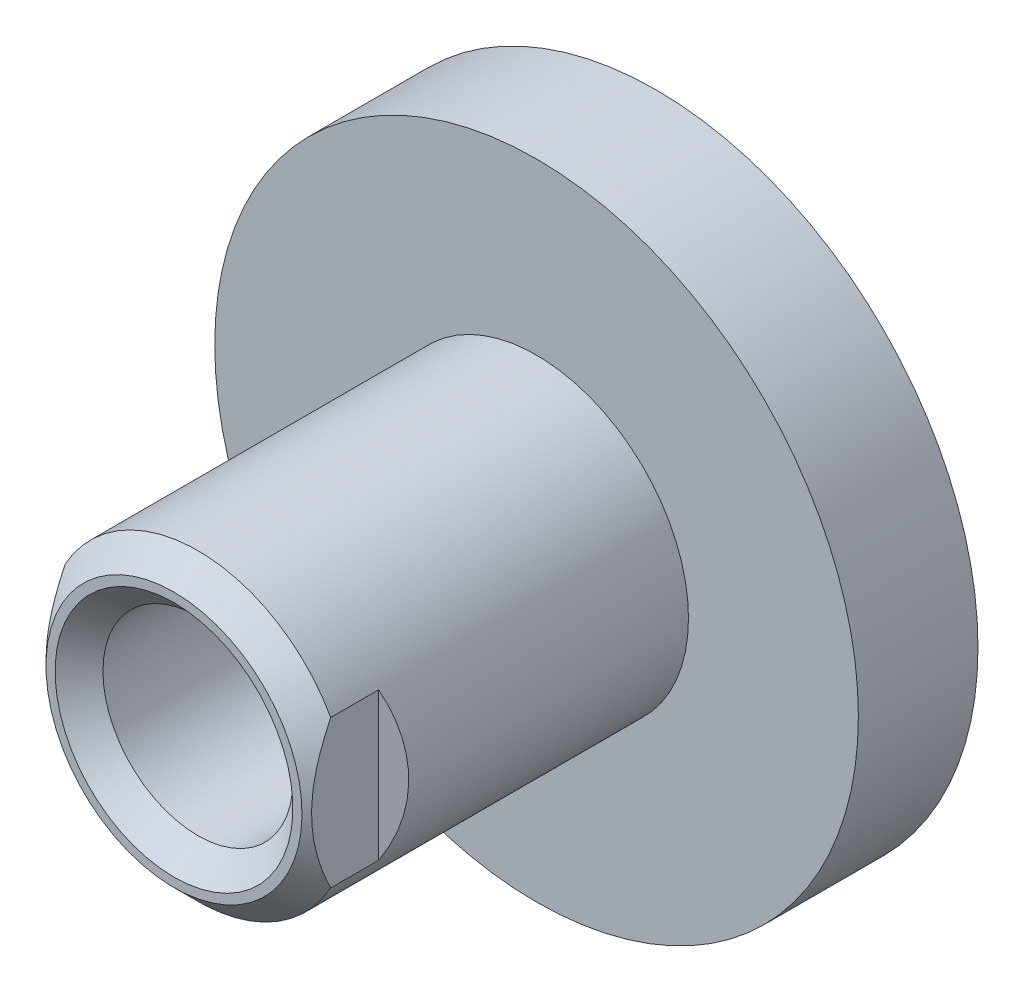
ISO-10303-21;
HEADER;
FILE_DESCRIPTION(('STEP AP214'),'2;1');
FILE_NAME('part.step','',(''),(''),'','','');
FILE_SCHEMA(('AUTOMOTIVE_DESIGN { 1 0 10303 214 1 1 1 1 }'));
ENDSEC;
DATA;
#1=APPLICATION_CONTEXT('core data for automotive mechanical design processes');
#2=APPLICATION_PROTOCOL_DEFINITION('international standard','automotive_design',2000,#1);
#3=PRODUCT_CONTEXT('',#1,'mechanical');
#4=PRODUCT('Part','Part','',(#3));
#5=PRODUCT_RELATED_PRODUCT_CATEGORY('part','',(#4));
#6=PRODUCT_DEFINITION_FORMATION('','',#4);
#7=PRODUCT_DEFINITION_CONTEXT('part definition',#1,'design');
#8=PRODUCT_DEFINITION('design','',#6,#7);
#9=PRODUCT_DEFINITION_SHAPE('','',#8);
#10=(LENGTH_UNIT() NAMED_UNIT(*) SI_UNIT(.MILLI.,.METRE.));
#11=(NAMED_UNIT(*) PLANE_ANGLE_UNIT() SI_UNIT($,.RADIAN.));
#12=(NAMED_UNIT(*) SI_UNIT($,.STERADIAN.) SOLID_ANGLE_UNIT());
#13=UNCERTAINTY_MEASURE_WITH_UNIT(LENGTH_MEASURE(1.E-05),#10,'distance_accuracy_value','');
#14=(GEOMETRIC_REPRESENTATION_CONTEXT(3) GLOBAL_UNCERTAINTY_ASSIGNED_CONTEXT((#13)) GLOBAL_UNIT_ASSIGNED_CONTEXT((#10,
#11,#12)) REPRESENTATION_CONTEXT('',''));
#15=CARTESIAN_POINT('',(0.,0.,0.));
#16=DIRECTION('',(0.,0.,1.));
#17=DIRECTION('',(1.,0.,0.));
#18=AXIS2_PLACEMENT_3D('',#15,#16,#17);
#19=CARTESIAN_POINT('',(0.,0.,5.));
#20=DIRECTION('',(0.,0.,-1.));
#21=DIRECTION('',(-1.,0.,0.));
#22=AXIS2_PLACEMENT_3D('',#19,#20,#21);
#23=CYLINDRICAL_SURFACE('',#22,13.45);
#24=CARTESIAN_POINT('',(0.,0.,5.));
#25=DIRECTION('',(0.,0.,1.));
#26=DIRECTION('',(1.,0.,0.));
#27=AXIS2_PLACEMENT_3D('',#24,#25,#26);
#28=CIRCLE('',#27,13.45);
#29=CARTESIAN_POINT('',(13.45,0.,5.));
#30=VERTEX_POINT('',#29);
#31=EDGE_CURVE('E115',#30,#30,#28,.T.);
#32=ORIENTED_EDGE('',*,*,#31,.F.);
#33=EDGE_LOOP('',(#32));
#34=FACE_BOUND('',#33,.T.);
#35=CARTESIAN_POINT('',(0.,0.,0.));
#36=DIRECTION('',(0.,0.,1.));
#37=DIRECTION('',(1.,0.,0.));
#38=AXIS2_PLACEMENT_3D('',#35,#36,#37);
#39=CIRCLE('',#38,13.45);
#40=CARTESIAN_POINT('',(13.45,0.,0.));
#41=VERTEX_POINT('',#40);
#42=EDGE_CURVE('E110',#41,#41,#39,.T.);
#43=ORIENTED_EDGE('',*,*,#42,.T.);
#44=EDGE_LOOP('',(#43));
#45=FACE_BOUND('',#44,.T.);
#46=ADVANCED_FACE('F34',(#34,#45),#23,.T.);
#47=CARTESIAN_POINT('',(0.,0.,5.));
#48=DIRECTION('',(0.,0.,1.));
#49=DIRECTION('',(1.,0.,0.));
#50=AXIS2_PLACEMENT_3D('',#47,#48,#49);
#51=PLANE('',#50);
#52=CARTESIAN_POINT('',(0.,0.,5.));
#53=DIRECTION('',(0.,0.,1.));
#54=DIRECTION('',(1.,0.,0.));
#55=AXIS2_PLACEMENT_3D('',#52,#53,#54);
#56=CIRCLE('',#55,6.35);
#57=CARTESIAN_POINT('',(6.35,0.,5.));
#58=VERTEX_POINT('',#57);
#59=EDGE_CURVE('E111',#58,#58,#56,.T.);
#60=ORIENTED_EDGE('',*,*,#59,.F.);
#61=EDGE_LOOP('',(#60));
#62=FACE_BOUND('',#61,.T.);
#63=ORIENTED_EDGE('',*,*,#31,.T.);
#64=EDGE_LOOP('',(#63));
#65=FACE_BOUND('',#64,.T.);
#66=ADVANCED_FACE('F174',(#62,#65),#51,.T.);
#67=CARTESIAN_POINT('',(0.,0.,0.));
#68=DIRECTION('',(0.,0.,1.));
#69=DIRECTION('',(1.,0.,0.));
#70=AXIS2_PLACEMENT_3D('',#67,#68,#69);
#71=PLANE('',#70);
#72=ORIENTED_EDGE('',*,*,#42,.F.);
#73=EDGE_LOOP('',(#72));
#74=FACE_BOUND('',#73,.T.);
#75=ADVANCED_FACE('F173',(#74),#71,.F.);
#76=CARTESIAN_POINT('',(0.,0.,38.1135122421383));
#77=DIRECTION('',(0.,0.,-1.));
#78=DIRECTION('',(-1.,0.,0.));
#79=AXIS2_PLACEMENT_3D('',#76,#77,#78);
#80=CYLINDRICAL_SURFACE('',#79,6.35);
#81=DIRECTION('',(0.,0.,-1.));
#82=VECTOR('',#81,1.);
#83=CARTESIAN_POINT('',(5.55000000000001,3.08544972410828,38.1135122421383));
#84=LINE('',#83,#82);
#85=CARTESIAN_POINT('',(5.55,3.08544972410827,17.153));
#86=VERTEX_POINT('',#85);
#87=CARTESIAN_POINT('',(5.55,3.0854497241083,19.153));
#88=VERTEX_POINT('',#87);
#89=EDGE_CURVE('E49',#86,#88,#84,.F.);
#90=ORIENTED_EDGE('',*,*,#89,.F.);
#91=CARTESIAN_POINT('',(0.,0.,20.3572939940025));
#92=DIRECTION('',(-0.500000000000004,0.,-0.866025403784436));
#93=DIRECTION('',(0.866025403784436,0.,-0.500000000000004));
#94=AXIS2_PLACEMENT_3D('',#91,#92,#93);
#95=ELLIPSE('',#94,7.33234841870827,6.35);
#96=CARTESIAN_POINT('',(5.55,-3.08544972410828,17.153));
#97=VERTEX_POINT('',#96);
#98=EDGE_CURVE('E12',#97,#86,#95,.F.);
#99=ORIENTED_EDGE('',*,*,#98,.F.);
#100=DIRECTION('',(0.,0.,-1.));
#101=VECTOR('',#100,1.);
#102=CARTESIAN_POINT('',(5.55000000000001,-3.08544972410828,38.1135122421383));
#103=LINE('',#102,#101);
#104=CARTESIAN_POINT('',(5.55,-3.0854497241083,19.153));
#105=VERTEX_POINT('',#104);
#106=EDGE_CURVE('E77',#105,#97,#103,.T.);
#107=ORIENTED_EDGE('',*,*,#106,.F.);
#108=CARTESIAN_POINT('',(0.,0.,19.153));
#109=DIRECTION('',(0.,0.,-1.));
#110=DIRECTION('',(-1.,0.,0.));
#111=AXIS2_PLACEMENT_3D('',#108,#109,#110);
#112=CIRCLE('',#111,6.35);
#113=CARTESIAN_POINT('',(-5.55,-3.0854497241083,19.153));
#114=VERTEX_POINT('',#113);
#115=EDGE_CURVE('E57',#105,#114,#112,.T.);
#116=ORIENTED_EDGE('',*,*,#115,.T.);
#117=DIRECTION('',(0.,0.,-1.));
#118=VECTOR('',#117,1.);
#119=CARTESIAN_POINT('',(-5.55,-3.0854497241083,38.1135122421383));
#120=LINE('',#119,#118);
#121=CARTESIAN_POINT('',(-5.55,-3.0854497241083,17.153));
#122=VERTEX_POINT('',#121);
#123=EDGE_CURVE('E99',#122,#114,#120,.F.);
#124=ORIENTED_EDGE('',*,*,#123,.F.);
#125=CARTESIAN_POINT('',(0.,0.,20.3572939940025));
#126=DIRECTION('',(0.500000000000004,0.,-0.866025403784436));
#127=DIRECTION('',(-0.866025403784436,0.,-0.500000000000004));
#128=AXIS2_PLACEMENT_3D('',#125,#126,#127);
#129=ELLIPSE('',#128,7.33234841870827,6.35);
#130=CARTESIAN_POINT('',(-5.55,3.08544972410829,17.153));
#131=VERTEX_POINT('',#130);
#132=EDGE_CURVE('E136',#131,#122,#129,.F.);
#133=ORIENTED_EDGE('',*,*,#132,.F.);
#134=DIRECTION('',(0.,0.,-1.));
#135=VECTOR('',#134,1.);
#136=CARTESIAN_POINT('',(-5.55,3.0854497241083,38.1135122421383));
#137=LINE('',#136,#135);
#138=CARTESIAN_POINT('',(-5.55,3.0854497241083,19.153));
#139=VERTEX_POINT('',#138);
#140=EDGE_CURVE('E95',#139,#131,#137,.T.);
#141=ORIENTED_EDGE('',*,*,#140,.F.);
#142=EDGE_CURVE('E91',#139,#88,#112,.T.);
#143=ORIENTED_EDGE('',*,*,#142,.T.);
#144=EDGE_LOOP('',(#90,#99,#107,#116,#124,#133,#141,#143));
#145=FACE_BOUND('',#144,.T.);
#146=ORIENTED_EDGE('',*,*,#59,.T.);
#147=EDGE_LOOP('',(#146));
#148=FACE_BOUND('',#147,.T.);
#149=ADVANCED_FACE('F86',(#145,#148),#80,.T.);
#150=CARTESIAN_POINT('',(0.,0.,20.153));
#151=DIRECTION('',(0.,0.,-1.));
#152=DIRECTION('',(0.,1.,0.));
#153=AXIS2_PLACEMENT_3D('',#150,#151,#152);
#154=PLANE('',#153);
#155=CARTESIAN_POINT('',(0.,0.,20.153));
#156=DIRECTION('',(0.,0.,-1.));
#157=DIRECTION('',(0.,1.,0.));
#158=AXIS2_PLACEMENT_3D('',#155,#156,#157);
#159=CIRCLE('',#158,5.35);
#160=CARTESIAN_POINT('',(0.,5.35,20.153));
#161=VERTEX_POINT('',#160);
#162=EDGE_CURVE('E122',#161,#161,#159,.F.);
#163=ORIENTED_EDGE('',*,*,#162,.T.);
#164=EDGE_LOOP('',(#163));
#165=FACE_BOUND('',#164,.T.);
#166=CARTESIAN_POINT('',(0.,0.,20.153));
#167=DIRECTION('',(0.,0.,-1.));
#168=DIRECTION('',(0.,1.,0.));
#169=AXIS2_PLACEMENT_3D('',#166,#167,#168);
#170=CIRCLE('',#169,4.96875);
#171=CARTESIAN_POINT('',(0.,4.96875,20.153));
#172=VERTEX_POINT('',#171);
#173=EDGE_CURVE('E114',#172,#172,#170,.T.);
#174=ORIENTED_EDGE('',*,*,#173,.T.);
#175=EDGE_LOOP('',(#174));
#176=FACE_BOUND('',#175,.T.);
#177=ADVANCED_FACE('F166',(#165,#176),#154,.F.);
#178=CARTESIAN_POINT('',(0.,0.,20.153));
#179=DIRECTION('',(0.,0.,1.));
#180=DIRECTION('',(0.,-1.,0.));
#181=AXIS2_PLACEMENT_3D('',#178,#179,#180);
#182=CYLINDRICAL_SURFACE('',#181,3.96875);
#183=CARTESIAN_POINT('',(0.,0.,19.153));
#184=DIRECTION('',(0.,0.,-1.));
#185=DIRECTION('',(0.,1.,0.));
#186=AXIS2_PLACEMENT_3D('',#183,#184,#185);
#187=CIRCLE('',#186,3.96875);
#188=CARTESIAN_POINT('',(0.,3.96875,19.153));
#189=VERTEX_POINT('',#188);
#190=EDGE_CURVE('E126',#189,#189,#187,.F.);
#191=ORIENTED_EDGE('',*,*,#190,.T.);
#192=EDGE_LOOP('',(#191));
#193=FACE_BOUND('',#192,.T.);
#194=CARTESIAN_POINT('',(0.,0.,6.945));
#195=DIRECTION('',(0.,0.,1.));
#196=DIRECTION('',(0.,-1.,0.));
#197=AXIS2_PLACEMENT_3D('',#194,#195,#196);
#198=CIRCLE('',#197,3.96875);
#199=CARTESIAN_POINT('',(0.,-3.96875,6.945));
#200=VERTEX_POINT('',#199);
#201=EDGE_CURVE('E107',#200,#200,#198,.T.);
#202=ORIENTED_EDGE('',*,*,#201,.F.);
#203=EDGE_LOOP('',(#202));
#204=FACE_BOUND('',#203,.T.);
#205=ADVANCED_FACE('F162',(#193,#204),#182,.F.);
#206=CARTESIAN_POINT('',(3.4544,0.,6.945));
#207=DIRECTION('',(0.,0.,-1.));
#208=DIRECTION('',(0.,1.,0.));
#209=AXIS2_PLACEMENT_3D('',#206,#207,#208);
#210=PLANE('',#209);
#211=CARTESIAN_POINT('',(0.,0.,6.945));
#212=DIRECTION('',(0.,0.,1.));
#213=DIRECTION('',(0.,-1.,0.));
#214=AXIS2_PLACEMENT_3D('',#211,#212,#213);
#215=CIRCLE('',#214,3.4544);
#216=CARTESIAN_POINT('',(0.,-3.4544,6.945));
#217=VERTEX_POINT('',#216);
#218=EDGE_CURVE('E104',#217,#217,#215,.T.);
#219=ORIENTED_EDGE('',*,*,#218,.F.);
#220=EDGE_LOOP('',(#219));
#221=FACE_BOUND('',#220,.T.);
#222=ORIENTED_EDGE('',*,*,#201,.T.);
#223=EDGE_LOOP('',(#222));
#224=FACE_BOUND('',#223,.T.);
#225=ADVANCED_FACE('F158',(#221,#224),#210,.F.);
#226=CARTESIAN_POINT('',(0.,0.,20.153));
#227=DIRECTION('',(0.,0.,1.));
#228=DIRECTION('',(0.,-1.,0.));
#229=AXIS2_PLACEMENT_3D('',#226,#227,#228);
#230=CYLINDRICAL_SURFACE('',#229,3.4544);
#231=CARTESIAN_POINT('',(0.,0.,3.77546));
#232=DIRECTION('',(0.,0.,1.));
#233=DIRECTION('',(0.,-1.,0.));
#234=AXIS2_PLACEMENT_3D('',#231,#232,#233);
#235=CIRCLE('',#234,3.4544);
#236=CARTESIAN_POINT('',(0.,-3.4544,3.77546));
#237=VERTEX_POINT('',#236);
#238=EDGE_CURVE('E101',#237,#237,#235,.T.);
#239=ORIENTED_EDGE('',*,*,#238,.F.);
#240=EDGE_LOOP('',(#239));
#241=FACE_BOUND('',#240,.T.);
#242=ORIENTED_EDGE('',*,*,#218,.T.);
#243=EDGE_LOOP('',(#242));
#244=FACE_BOUND('',#243,.T.);
#245=ADVANCED_FACE('F154',(#241,#244),#230,.F.);
#246=CARTESIAN_POINT('',(0.,0.,3.77546));
#247=DIRECTION('',(0.,0.,1.));
#248=DIRECTION('',(0.,-1.,0.));
#249=AXIS2_PLACEMENT_3D('',#246,#247,#248);
#250=CONICAL_SURFACE('',#249,3.4544,1.02974425867665);
#251=CARTESIAN_POINT('',(0.,0.,1.69984707763119));
#252=VERTEX_POINT('',#251);
#253=VERTEX_LOOP('',#252);
#254=FACE_BOUND('',#253,.T.);
#255=ORIENTED_EDGE('',*,*,#238,.T.);
#256=EDGE_LOOP('',(#255));
#257=FACE_BOUND('',#256,.T.);
#258=ADVANCED_FACE('F151',(#254,#257),#250,.F.);
#259=CARTESIAN_POINT('',(0.,0.,20.153));
#260=DIRECTION('',(0.,0.,-1.));
#261=DIRECTION('',(-1.,0.,0.));
#262=AXIS2_PLACEMENT_3D('',#259,#260,#261);
#263=CONICAL_SURFACE('',#262,5.35,0.785398163397447);
#264=CARTESIAN_POINT('',(5.55,-15.2257109308689,9.29729812225391));
#265=CARTESIAN_POINT('',(5.55,-14.8747660682723,9.62698725037945));
#266=CARTESIAN_POINT('',(5.55,-14.5231839214945,9.95600204692669));
#267=CARTESIAN_POINT('',(5.55,-13.8183708799046,10.612295534622));
#268=CARTESIAN_POINT('',(5.55,-13.4651399038553,10.9395741384943));
#269=CARTESIAN_POINT('',(5.55,-12.7557714274258,11.5928206949676));
#270=CARTESIAN_POINT('',(5.55,-12.3996287655052,11.9187830487562));
#271=CARTESIAN_POINT('',(5.55,-11.6848468120074,12.5679416247751));
#272=CARTESIAN_POINT('',(5.55,-11.3262075922272,12.8911379259617));
#273=CARTESIAN_POINT('',(5.55,-10.5681812142873,13.5674800600736));
#274=CARTESIAN_POINT('',(5.55,-10.1684445507318,13.9202347848927));
#275=CARTESIAN_POINT('',(5.55,-9.36375979042052,14.6198575684849));
#276=CARTESIAN_POINT('',(5.55,-8.95881119519525,14.9667250567348));
#277=CARTESIAN_POINT('',(5.55,-8.3463401786314,15.4804416256788));
#278=CARTESIAN_POINT('',(5.55,-8.14148387552709,15.6504688140961));
#279=CARTESIAN_POINT('',(5.55,-7.72966281385332,15.9879475153287));
#280=CARTESIAN_POINT('',(5.55,-7.52269809394953,16.1553990752368));
#281=CARTESIAN_POINT('',(5.55,-7.10628859570216,16.4871249040082));
#282=CARTESIAN_POINT('',(5.55,-6.89684422727012,16.6513996865209));
#283=CARTESIAN_POINT('',(5.55,-6.47494506112873,16.9760287734008));
#284=CARTESIAN_POINT('',(5.55,-6.26249041002758,17.1363832676662));
#285=CARTESIAN_POINT('',(5.55,-5.87573136408904,17.4213456709768));
#286=CARTESIAN_POINT('',(5.55,-5.70206976357208,17.5468245831364));
#287=CARTESIAN_POINT('',(5.55,-5.35197108030316,17.7938691965489));
#288=CARTESIAN_POINT('',(5.55,-5.1755339337746,17.9154348076858));
#289=CARTESIAN_POINT('',(5.55,-4.81911478544158,18.1539322735784));
#290=CARTESIAN_POINT('',(5.55,-4.63912736864526,18.2708560728319));
#291=CARTESIAN_POINT('',(5.55,-4.27535559247412,18.4986413207277));
#292=CARTESIAN_POINT('',(5.55,-4.0915713810179,18.6095030049314));
#293=CARTESIAN_POINT('',(5.55,-3.72354654803682,18.8212969253187));
#294=CARTESIAN_POINT('',(5.55,-3.53940054701999,18.9223913082401));
#295=CARTESIAN_POINT('',(5.55,-3.16633947147467,19.1153031288623));
#296=CARTESIAN_POINT('',(5.55,-2.97742339074242,19.2071185884796));
#297=CARTESIAN_POINT('',(5.55,-2.40369591669061,19.4644720904119));
#298=CARTESIAN_POINT('',(5.55,-2.01043177147509,19.6128089000865));
#299=CARTESIAN_POINT('',(5.55,-1.46942864784132,19.7632963567673));
#300=CARTESIAN_POINT('',(5.55,-1.33041525946339,19.7974108495877));
#301=CARTESIAN_POINT('',(5.55,-1.05034859465557,19.8561428709252));
#302=CARTESIAN_POINT('',(5.55,-0.909295163074094,19.8807596731313));
#303=CARTESIAN_POINT('',(5.55,-0.626178557163027,19.9195418073362));
#304=CARTESIAN_POINT('',(5.55,-0.484119696532714,19.9337383553584));
#305=CARTESIAN_POINT('',(5.55,-0.199324818006786,19.951241169692));
#306=CARTESIAN_POINT('',(5.55,-0.0565887824099692,19.9545471497382));
#307=CARTESIAN_POINT('',(5.55,0.253206621535195,19.9497381766509));
#308=CARTESIAN_POINT('',(5.55,0.420237314865596,19.9395663096084));
#309=CARTESIAN_POINT('',(5.55,0.752766413774219,19.904626590524));
#310=CARTESIAN_POINT('',(5.55,0.918264505933158,19.8798558171323));
#311=CARTESIAN_POINT('',(5.55,1.24857030854469,19.8166274265459));
#312=CARTESIAN_POINT('',(5.55,1.41334806537883,19.7780153162229));
#313=CARTESIAN_POINT('',(5.55,1.73957469638617,19.6888806485968));
#314=CARTESIAN_POINT('',(5.55,1.90102413104621,19.6383601147771));
#315=CARTESIAN_POINT('',(5.55,2.24625544842708,19.5181954162436));
#316=CARTESIAN_POINT('',(5.55,2.42941590979714,19.4467788824747));
#317=CARTESIAN_POINT('',(5.55,2.79106314076646,19.2928687054701));
#318=CARTESIAN_POINT('',(5.55,2.96954767192589,19.2103698687139));
#319=CARTESIAN_POINT('',(5.55,3.32269430903289,19.0362293267029));
#320=CARTESIAN_POINT('',(5.55,3.49734192746174,18.9445584691496));
#321=CARTESIAN_POINT('',(5.55,3.84264808956271,18.754095685499));
#322=CARTESIAN_POINT('',(5.55,4.01330725693172,18.6553048827897));
#323=CARTESIAN_POINT('',(5.55,4.34393336565146,18.4563280209908));
#324=CARTESIAN_POINT('',(5.55,4.50404555137037,18.3563820494251));
#325=CARTESIAN_POINT('',(5.55,4.82150308343818,18.15217481953));
#326=CARTESIAN_POINT('',(5.55,4.97884820876749,18.0479132186993));
#327=CARTESIAN_POINT('',(5.55,5.28984937079436,17.8367062388828));
#328=CARTESIAN_POINT('',(5.55,5.44352501403342,17.7297896257873));
#329=CARTESIAN_POINT('',(5.55,5.74875290071372,17.5130544455249));
#330=CARTESIAN_POINT('',(5.55,5.90030573518156,17.4032367116833));
#331=CARTESIAN_POINT('',(5.55,6.05096826679848,17.2922316458323));
#332=B_SPLINE_CURVE_WITH_KNOTS('',3,(#264,#265,#266,#267,#268,#269,#270,#271,#272,#273,#274,
#275,#276,#277,#278,#279,#280,#281,#282,#283,#284,#285,#286,#287,#288,#289,#290,#291,#292,#293,
#294,#295,#296,#297,#298,#299,#300,#301,#302,#303,#304,#305,#306,#307,#308,#309,#310,#311,#312,
#313,#314,#315,#316,#317,#318,#319,#320,#321,#322,#323,#324,#325,#326,#327,#328,#329,#330,#331),
.UNSPECIFIED.,.F.,.F.,(4,2,2,2,2,2,2,2,2,2,2,2,2,2,2,2,2,2,2,2,2,2,2,2,2,2,2,2,2,2,2,2,2,4),(0.,
1.44454987959452,2.88917169914314,4.33753932082825,5.785865460413,7.38521167286338,
8.98471200064814,9.78336870915713,10.5820107975901,11.380522656212,12.178995758102,
12.8217040076065,13.4644270469158,14.1082206398331,14.7519891984382,15.381928024546,
16.0120008591675,17.2669998693463,17.6961544806242,18.1253419038767,18.5532383007309,
18.981145945015,19.4824734084604,19.9839012253367,20.4911096205871,20.998231892869,
21.5875451584991,22.1771355648775,22.7686633405362,23.3600979881646,23.926255178394,
24.4924573870239,25.0540492100914,25.6154814373965),.UNSPECIFIED.);
#333=EDGE_CURVE('E42',#88,#105,#332,.F.);
#334=ORIENTED_EDGE('',*,*,#333,.F.);
#335=ORIENTED_EDGE('',*,*,#142,.F.);
#336=CARTESIAN_POINT('',(-5.55,-15.2257109308689,9.29729812225391));
#337=CARTESIAN_POINT('',(-5.55,-14.8747660682723,9.62698725037945));
#338=CARTESIAN_POINT('',(-5.55,-14.5231839214945,9.95600204692669));
#339=CARTESIAN_POINT('',(-5.55,-13.8183708799046,10.612295534622));
#340=CARTESIAN_POINT('',(-5.55,-13.4651399038552,10.9395741384943));
#341=CARTESIAN_POINT('',(-5.55,-12.7557714274258,11.5928206949676));
#342=CARTESIAN_POINT('',(-5.55,-12.3996287655052,11.9187830487562));
#343=CARTESIAN_POINT('',(-5.55,-11.6848468120073,12.5679416247751));
#344=CARTESIAN_POINT('',(-5.55,-11.3262075922272,12.8911379259617));
#345=CARTESIAN_POINT('',(-5.55,-10.5681812142873,13.5674800600736));
#346=CARTESIAN_POINT('',(-5.55,-10.1684445507318,13.9202347848927));
#347=CARTESIAN_POINT('',(-5.55,-9.36375979042052,14.6198575684849));
#348=CARTESIAN_POINT('',(-5.55,-8.95881119519524,14.9667250567348));
#349=CARTESIAN_POINT('',(-5.55,-8.34634017863139,15.4804416256788));
#350=CARTESIAN_POINT('',(-5.55,-8.14148387552708,15.6504688140961));
#351=CARTESIAN_POINT('',(-5.55,-7.72966281385331,15.9879475153287));
#352=CARTESIAN_POINT('',(-5.55,-7.52269809394952,16.1553990752368));
#353=CARTESIAN_POINT('',(-5.55,-7.10628859570215,16.4871249040082));
#354=CARTESIAN_POINT('',(-5.55,-6.89684422727011,16.6513996865209));
#355=CARTESIAN_POINT('',(-5.55,-6.47494506112872,16.9760287734008));
#356=CARTESIAN_POINT('',(-5.55,-6.26249041002757,17.1363832676662));
#357=CARTESIAN_POINT('',(-5.55,-5.87573136408903,17.4213456709768));
#358=CARTESIAN_POINT('',(-5.55,-5.70206976357207,17.5468245831364));
#359=CARTESIAN_POINT('',(-5.55,-5.35197108030315,17.7938691965489));
#360=CARTESIAN_POINT('',(-5.55,-5.17553393377459,17.9154348076858));
#361=CARTESIAN_POINT('',(-5.55,-4.81911478544157,18.1539322735784));
#362=CARTESIAN_POINT('',(-5.55,-4.63912736864526,18.2708560728319));
#363=CARTESIAN_POINT('',(-5.55,-4.27535559247411,18.4986413207277));
#364=CARTESIAN_POINT('',(-5.55,-4.0915713810179,18.6095030049314));
#365=CARTESIAN_POINT('',(-5.55,-3.72354654803681,18.8212969253187));
#366=CARTESIAN_POINT('',(-5.55,-3.53940054701998,18.9223913082401));
#367=CARTESIAN_POINT('',(-5.55,-3.16633947147467,19.1153031288623));
#368=CARTESIAN_POINT('',(-5.55,-2.97742339074241,19.2071185884796));
#369=CARTESIAN_POINT('',(-5.55,-2.40369591669061,19.4644720904119));
#370=CARTESIAN_POINT('',(-5.55,-2.01043177147509,19.6128089000865));
#371=CARTESIAN_POINT('',(-5.55,-1.46942864784132,19.7632963567673));
#372=CARTESIAN_POINT('',(-5.55,-1.3304152594634,19.7974108495877));
#373=CARTESIAN_POINT('',(-5.55,-1.05034859465557,19.8561428709252));
#374=CARTESIAN_POINT('',(-5.55,-0.909295163074096,19.8807596731313));
#375=CARTESIAN_POINT('',(-5.55,-0.626178557163029,19.9195418073362));
#376=CARTESIAN_POINT('',(-5.55,-0.484119696532717,19.9337383553584));
#377=CARTESIAN_POINT('',(-5.55,-0.199324818006787,19.951241169692));
#378=CARTESIAN_POINT('',(-5.55,-0.0565887824099694,19.9545471497382));
#379=CARTESIAN_POINT('',(-5.55,0.253206621535195,19.9497381766509));
#380=CARTESIAN_POINT('',(-5.55,0.420237314865595,19.9395663096084));
#381=CARTESIAN_POINT('',(-5.55,0.752766413774217,19.904626590524));
#382=CARTESIAN_POINT('',(-5.55,0.918264505933156,19.8798558171323));
#383=CARTESIAN_POINT('',(-5.55,1.24857030854468,19.8166274265459));
#384=CARTESIAN_POINT('',(-5.55,1.41334806537882,19.7780153162229));
#385=CARTESIAN_POINT('',(-5.55,1.73957469638617,19.6888806485968));
#386=CARTESIAN_POINT('',(-5.55,1.90102413104621,19.6383601147771));
#387=CARTESIAN_POINT('',(-5.55,2.24625544842708,19.5181954162436));
#388=CARTESIAN_POINT('',(-5.55,2.42941590979713,19.4467788824747));
#389=CARTESIAN_POINT('',(-5.55,2.79106314076646,19.2928687054701));
#390=CARTESIAN_POINT('',(-5.55,2.96954767192588,19.2103698687139));
#391=CARTESIAN_POINT('',(-5.55,3.32269430903288,19.0362293267029));
#392=CARTESIAN_POINT('',(-5.55,3.49734192746173,18.9445584691496));
#393=CARTESIAN_POINT('',(-5.55,3.8426480895627,18.754095685499));
#394=CARTESIAN_POINT('',(-5.55,4.01330725693171,18.6553048827897));
#395=CARTESIAN_POINT('',(-5.55,4.34393336565145,18.4563280209908));
#396=CARTESIAN_POINT('',(-5.55,4.50404555137036,18.3563820494251));
#397=CARTESIAN_POINT('',(-5.55,4.82150308343817,18.15217481953));
#398=CARTESIAN_POINT('',(-5.55,4.97884820876748,18.0479132186993));
#399=CARTESIAN_POINT('',(-5.55,5.28984937079435,17.8367062388828));
#400=CARTESIAN_POINT('',(-5.55,5.44352501403341,17.7297896257873));
#401=CARTESIAN_POINT('',(-5.55,5.74875290071371,17.5130544455249));
#402=CARTESIAN_POINT('',(-5.55,5.90030573518155,17.4032367116834));
#403=CARTESIAN_POINT('',(-5.55,6.05096826679847,17.2922316458323));
#404=B_SPLINE_CURVE_WITH_KNOTS('',3,(#336,#337,#338,#339,#340,#341,#342,#343,#344,#345,#346,
#347,#348,#349,#350,#351,#352,#353,#354,#355,#356,#357,#358,#359,#360,#361,#362,#363,#364,#365,
#366,#367,#368,#369,#370,#371,#372,#373,#374,#375,#376,#377,#378,#379,#380,#381,#382,#383,#384,
#385,#386,#387,#388,#389,#390,#391,#392,#393,#394,#395,#396,#397,#398,#399,#400,#401,#402,#403),
.UNSPECIFIED.,.F.,.F.,(4,2,2,2,2,2,2,2,2,2,2,2,2,2,2,2,2,2,2,2,2,2,2,2,2,2,2,2,2,2,2,2,2,4),(0.,
1.44454987959453,2.88917169914315,4.33753932082826,5.78586546041302,7.38521167286339,
8.98471200064816,9.78336870915715,10.5820107975901,11.380522656212,12.1789957581021,
12.8217040076065,13.4644270469158,14.1082206398331,14.7519891984382,15.381928024546,
16.0120008591675,17.2669998693463,17.6961544806242,18.1253419038767,18.5532383007309,
18.981145945015,19.4824734084604,19.9839012253367,20.4911096205871,20.998231892869,
21.5875451584991,22.1771355648775,22.7686633405362,23.3600979881646,23.926255178394,
24.4924573870239,25.0540492100914,25.6154814373965),.UNSPECIFIED.);
#405=EDGE_CURVE('E129',#114,#139,#404,.T.);
#406=ORIENTED_EDGE('',*,*,#405,.F.);
#407=ORIENTED_EDGE('',*,*,#115,.F.);
#408=EDGE_LOOP('',(#334,#335,#406,#407));
#409=FACE_BOUND('',#408,.T.);
#410=ORIENTED_EDGE('',*,*,#162,.F.);
#411=EDGE_LOOP('',(#410));
#412=FACE_BOUND('',#411,.T.);
#413=ADVANCED_FACE('F137',(#409,#412),#263,.T.);
#414=CARTESIAN_POINT('',(0.,0.,19.153));
#415=DIRECTION('',(0.,0.,1.));
#416=DIRECTION('',(0.,-1.,0.));
#417=AXIS2_PLACEMENT_3D('',#414,#415,#416);
#418=CONICAL_SURFACE('',#417,3.96875,0.78539816339745);
#419=ORIENTED_EDGE('',*,*,#173,.F.);
#420=EDGE_LOOP('',(#419));
#421=FACE_BOUND('',#420,.T.);
#422=ORIENTED_EDGE('',*,*,#190,.F.);
#423=EDGE_LOOP('',(#422));
#424=FACE_BOUND('',#423,.T.);
#425=ADVANCED_FACE('F36',(#421,#424),#418,.F.);
#426=CARTESIAN_POINT('',(-5.55,-13.45,17.153));
#427=DIRECTION('',(0.500000000000004,0.,-0.866025403784436));
#428=DIRECTION('',(-0.866025403784436,0.,-0.500000000000004));
#429=AXIS2_PLACEMENT_3D('',#426,#427,#428);
#430=PLANE('',#429);
#431=ORIENTED_EDGE('',*,*,#132,.T.);
#432=DIRECTION('',(0.,1.,0.));
#433=VECTOR('',#432,1.);
#434=CARTESIAN_POINT('',(-5.55,-13.45,17.153));
#435=LINE('',#434,#433);
#436=EDGE_CURVE('E92',#122,#131,#435,.T.);
#437=ORIENTED_EDGE('',*,*,#436,.T.);
#438=EDGE_LOOP('',(#431,#437));
#439=FACE_BOUND('',#438,.T.);
#440=ADVANCED_FACE('F145',(#439),#430,.F.);
#441=CARTESIAN_POINT('',(-5.55,-13.45,20.153));
#442=DIRECTION('',(1.,0.,0.));
#443=DIRECTION('',(0.,0.,-1.));
#444=AXIS2_PLACEMENT_3D('',#441,#442,#443);
#445=PLANE('',#444);
#446=ORIENTED_EDGE('',*,*,#123,.T.);
#447=ORIENTED_EDGE('',*,*,#405,.T.);
#448=ORIENTED_EDGE('',*,*,#140,.T.);
#449=ORIENTED_EDGE('',*,*,#436,.F.);
#450=EDGE_LOOP('',(#446,#447,#448,#449));
#451=FACE_BOUND('',#450,.T.);
#452=ADVANCED_FACE('F140',(#451),#445,.F.);
#453=CARTESIAN_POINT('',(5.55,-13.45,17.153));
#454=DIRECTION('',(-0.500000000000004,0.,-0.866025403784436));
#455=DIRECTION('',(-0.866025403784436,0.,0.500000000000004));
#456=AXIS2_PLACEMENT_3D('',#453,#454,#455);
#457=PLANE('',#456);
#458=ORIENTED_EDGE('',*,*,#98,.T.);
#459=DIRECTION('',(0.,1.,0.));
#460=VECTOR('',#459,1.);
#461=CARTESIAN_POINT('',(5.55,-13.45,17.153));
#462=LINE('',#461,#460);
#463=EDGE_CURVE('E80',#97,#86,#462,.T.);
#464=ORIENTED_EDGE('',*,*,#463,.F.);
#465=EDGE_LOOP('',(#458,#464));
#466=FACE_BOUND('',#465,.T.);
#467=ADVANCED_FACE('F84',(#466),#457,.F.);
#468=CARTESIAN_POINT('',(5.55,-13.45,20.153));
#469=DIRECTION('',(-1.,0.,0.));
#470=DIRECTION('',(0.,0.,1.));
#471=AXIS2_PLACEMENT_3D('',#468,#469,#470);
#472=PLANE('',#471);
#473=ORIENTED_EDGE('',*,*,#89,.T.);
#474=ORIENTED_EDGE('',*,*,#333,.T.);
#475=ORIENTED_EDGE('',*,*,#106,.T.);
#476=ORIENTED_EDGE('',*,*,#463,.T.);
#477=EDGE_LOOP('',(#473,#474,#475,#476));
#478=FACE_BOUND('',#477,.T.);
#479=ADVANCED_FACE('F79',(#478),#472,.F.);
#480=CLOSED_SHELL('',(#46,#66,#75,#149,#177,#205,#225,#245,#258,#413,#425,#440,#452,#467,#479));
#481=MANIFOLD_SOLID_BREP('B2',#480);
#482=ADVANCED_BREP_SHAPE_REPRESENTATION('',(#18,#481),#14);
#483=SHAPE_DEFINITION_REPRESENTATION(#9,#482);
ENDSEC;
END-ISO-10303-21;
